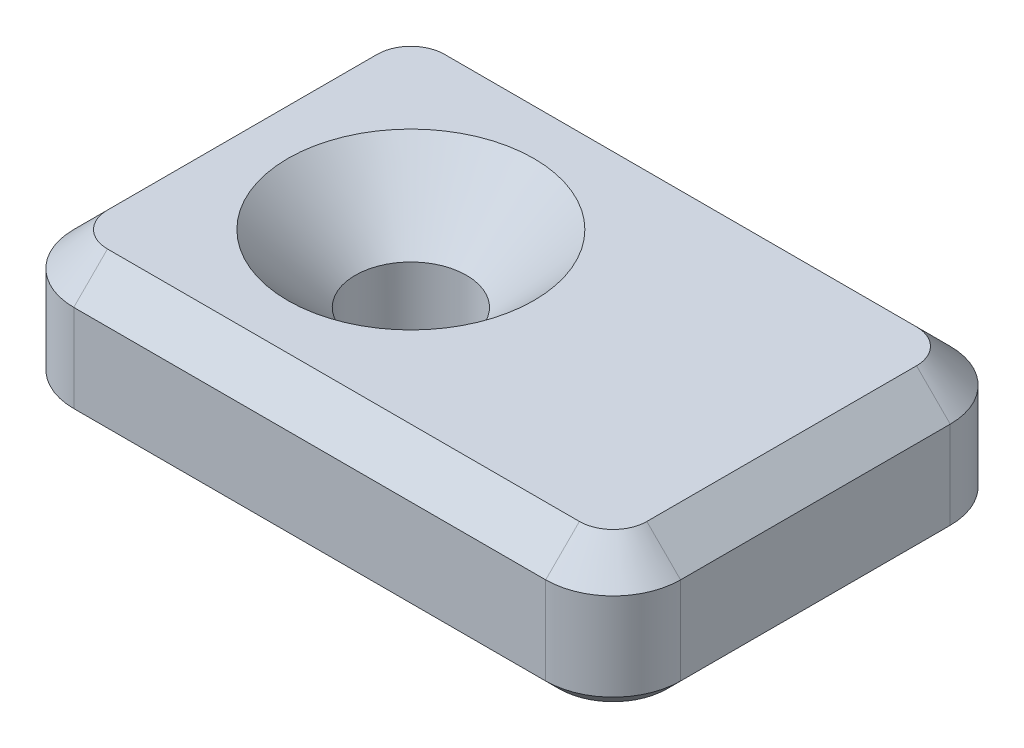
ISO-10303-21;
HEADER;
FILE_DESCRIPTION(('STEP AP214'),'2;1');
FILE_NAME('part.step','',(''),(''),'','','');
FILE_SCHEMA(('AUTOMOTIVE_DESIGN { 1 0 10303 214 1 1 1 1 }'));
ENDSEC;
DATA;
#1=APPLICATION_CONTEXT('core data for automotive mechanical design processes');
#2=APPLICATION_PROTOCOL_DEFINITION('international standard','automotive_design',2000,#1);
#3=PRODUCT_CONTEXT('',#1,'mechanical');
#4=PRODUCT('Part','Part','',(#3));
#5=PRODUCT_RELATED_PRODUCT_CATEGORY('part','',(#4));
#6=PRODUCT_DEFINITION_FORMATION('','',#4);
#7=PRODUCT_DEFINITION_CONTEXT('part definition',#1,'design');
#8=PRODUCT_DEFINITION('design','',#6,#7);
#9=PRODUCT_DEFINITION_SHAPE('','',#8);
#10=(LENGTH_UNIT() NAMED_UNIT(*) SI_UNIT(.MILLI.,.METRE.));
#11=(NAMED_UNIT(*) PLANE_ANGLE_UNIT() SI_UNIT($,.RADIAN.));
#12=(NAMED_UNIT(*) SI_UNIT($,.STERADIAN.) SOLID_ANGLE_UNIT());
#13=UNCERTAINTY_MEASURE_WITH_UNIT(LENGTH_MEASURE(1.E-05),#10,'distance_accuracy_value','');
#14=(GEOMETRIC_REPRESENTATION_CONTEXT(3) GLOBAL_UNCERTAINTY_ASSIGNED_CONTEXT((#13)) GLOBAL_UNIT_ASSIGNED_CONTEXT((#10,
#11,#12)) REPRESENTATION_CONTEXT('',''));
#15=CARTESIAN_POINT('',(0.,0.,0.));
#16=DIRECTION('',(0.,0.,1.));
#17=DIRECTION('',(1.,0.,0.));
#18=AXIS2_PLACEMENT_3D('',#15,#16,#17);
#19=CARTESIAN_POINT('',(16.,4.,-10.));
#20=DIRECTION('',(0.,-1.,0.));
#21=DIRECTION('',(0.,0.,-1.));
#22=AXIS2_PLACEMENT_3D('',#19,#20,#21);
#23=PLANE('',#22);
#24=CARTESIAN_POINT('',(16.,4.,-2.));
#25=DIRECTION('',(0.,-1.,0.));
#26=DIRECTION('',(0.,0.,-1.));
#27=AXIS2_PLACEMENT_3D('',#24,#25,#26);
#28=CIRCLE('',#27,1.);
#29=CARTESIAN_POINT('',(16.,4.,-0.999999999999997));
#30=VERTEX_POINT('',#29);
#31=CARTESIAN_POINT('',(17.,4.,-2.00000000000001));
#32=VERTEX_POINT('',#31);
#33=EDGE_CURVE('E317',#30,#32,#28,.F.);
#34=ORIENTED_EDGE('',*,*,#33,.T.);
#35=DIRECTION('',(0.,0.,-1.));
#36=VECTOR('',#35,1.);
#37=CARTESIAN_POINT('',(17.,4.,-10.));
#38=LINE('',#37,#36);
#39=CARTESIAN_POINT('',(17.,4.,-9.99999999999999));
#40=VERTEX_POINT('',#39);
#41=EDGE_CURVE('E321',#32,#40,#38,.T.);
#42=ORIENTED_EDGE('',*,*,#41,.T.);
#43=CARTESIAN_POINT('',(16.,4.,-10.));
#44=DIRECTION('',(0.,-1.,0.));
#45=DIRECTION('',(0.,0.,-1.));
#46=AXIS2_PLACEMENT_3D('',#43,#44,#45);
#47=CIRCLE('',#46,1.);
#48=CARTESIAN_POINT('',(16.,4.,-11.));
#49=VERTEX_POINT('',#48);
#50=EDGE_CURVE('E319',#40,#49,#47,.F.);
#51=ORIENTED_EDGE('',*,*,#50,.T.);
#52=DIRECTION('',(-1.,0.,0.));
#53=VECTOR('',#52,1.);
#54=CARTESIAN_POINT('',(16.,4.,-11.));
#55=LINE('',#54,#53);
#56=CARTESIAN_POINT('',(2.00000000000001,4.,-11.));
#57=VERTEX_POINT('',#56);
#58=EDGE_CURVE('E165',#49,#57,#55,.T.);
#59=ORIENTED_EDGE('',*,*,#58,.T.);
#60=CARTESIAN_POINT('',(2.,4.,-10.));
#61=DIRECTION('',(0.,-1.,0.));
#62=DIRECTION('',(0.,0.,-1.));
#63=AXIS2_PLACEMENT_3D('',#60,#61,#62);
#64=CIRCLE('',#63,1.);
#65=CARTESIAN_POINT('',(0.999999999999997,4.,-9.99999999999999));
#66=VERTEX_POINT('',#65);
#67=EDGE_CURVE('E159',#57,#66,#64,.F.);
#68=ORIENTED_EDGE('',*,*,#67,.T.);
#69=DIRECTION('',(0.,0.,1.));
#70=VECTOR('',#69,1.);
#71=CARTESIAN_POINT('',(0.999999999999997,4.,-10.));
#72=LINE('',#71,#70);
#73=CARTESIAN_POINT('',(0.999999999999997,4.,-2.00000000000001));
#74=VERTEX_POINT('',#73);
#75=EDGE_CURVE('E162',#66,#74,#72,.T.);
#76=ORIENTED_EDGE('',*,*,#75,.T.);
#77=CARTESIAN_POINT('',(2.,4.,-2.));
#78=DIRECTION('',(0.,-1.,0.));
#79=DIRECTION('',(0.,0.,-1.));
#80=AXIS2_PLACEMENT_3D('',#77,#78,#79);
#81=CIRCLE('',#80,1.);
#82=CARTESIAN_POINT('',(2.00000000000001,4.,-0.999999999999997));
#83=VERTEX_POINT('',#82);
#84=EDGE_CURVE('E171',#74,#83,#81,.F.);
#85=ORIENTED_EDGE('',*,*,#84,.T.);
#86=DIRECTION('',(1.,0.,0.));
#87=VECTOR('',#86,1.);
#88=CARTESIAN_POINT('',(16.,4.,-0.999999999999997));
#89=LINE('',#88,#87);
#90=EDGE_CURVE('E170',#83,#30,#89,.T.);
#91=ORIENTED_EDGE('',*,*,#90,.T.);
#92=EDGE_LOOP('',(#34,#42,#51,#59,#68,#76,#85,#91));
#93=FACE_BOUND('',#92,.T.);
#94=CARTESIAN_POINT('',(6.,4.,-6.));
#95=DIRECTION('',(0.,-1.,0.));
#96=DIRECTION('',(0.,0.,-1.));
#97=AXIS2_PLACEMENT_3D('',#94,#95,#96);
#98=CIRCLE('',#97,3.65000000000001);
#99=CARTESIAN_POINT('',(6.,4.,-9.65000000000001));
#100=VERTEX_POINT('',#99);
#101=EDGE_CURVE('E182',#100,#100,#98,.T.);
#102=ORIENTED_EDGE('',*,*,#101,.T.);
#103=EDGE_LOOP('',(#102));
#104=FACE_BOUND('',#103,.T.);
#105=ADVANCED_FACE('F43',(#93,#104),#23,.F.);
#106=CARTESIAN_POINT('',(16.,0.,-10.));
#107=DIRECTION('',(0.,-1.,0.));
#108=DIRECTION('',(0.,0.,-1.));
#109=AXIS2_PLACEMENT_3D('',#106,#107,#108);
#110=PLANE('',#109);
#111=CARTESIAN_POINT('',(2.,0.,-10.));
#112=DIRECTION('',(0.,-1.,0.));
#113=DIRECTION('',(0.,0.,-1.));
#114=AXIS2_PLACEMENT_3D('',#111,#112,#113);
#115=CIRCLE('',#114,1.6);
#116=CARTESIAN_POINT('',(0.400000000000001,0.,-9.99999999999999));
#117=VERTEX_POINT('',#116);
#118=CARTESIAN_POINT('',(2.00000000000001,0.,-11.6));
#119=VERTEX_POINT('',#118);
#120=EDGE_CURVE('E211',#117,#119,#115,.T.);
#121=ORIENTED_EDGE('',*,*,#120,.T.);
#122=DIRECTION('',(1.,0.,0.));
#123=VECTOR('',#122,1.);
#124=CARTESIAN_POINT('',(16.,0.,-11.6));
#125=LINE('',#124,#123);
#126=CARTESIAN_POINT('',(16.,0.,-11.6));
#127=VERTEX_POINT('',#126);
#128=EDGE_CURVE('E213',#119,#127,#125,.T.);
#129=ORIENTED_EDGE('',*,*,#128,.T.);
#130=CARTESIAN_POINT('',(16.,0.,-10.));
#131=DIRECTION('',(0.,-1.,0.));
#132=DIRECTION('',(0.,0.,-1.));
#133=AXIS2_PLACEMENT_3D('',#130,#131,#132);
#134=CIRCLE('',#133,1.6);
#135=CARTESIAN_POINT('',(17.6,0.,-9.99999999999999));
#136=VERTEX_POINT('',#135);
#137=EDGE_CURVE('E209',#127,#136,#134,.T.);
#138=ORIENTED_EDGE('',*,*,#137,.T.);
#139=DIRECTION('',(0.,0.,1.));
#140=VECTOR('',#139,1.);
#141=CARTESIAN_POINT('',(17.6,0.,-2.00000000000001));
#142=LINE('',#141,#140);
#143=CARTESIAN_POINT('',(17.6,0.,-2.00000000000001));
#144=VERTEX_POINT('',#143);
#145=EDGE_CURVE('E205',#136,#144,#142,.T.);
#146=ORIENTED_EDGE('',*,*,#145,.T.);
#147=CARTESIAN_POINT('',(16.,0.,-2.));
#148=DIRECTION('',(0.,-1.,0.));
#149=DIRECTION('',(0.,0.,-1.));
#150=AXIS2_PLACEMENT_3D('',#147,#148,#149);
#151=CIRCLE('',#150,1.6);
#152=CARTESIAN_POINT('',(16.,0.,-0.400000000000001));
#153=VERTEX_POINT('',#152);
#154=EDGE_CURVE('E201',#144,#153,#151,.T.);
#155=ORIENTED_EDGE('',*,*,#154,.T.);
#156=DIRECTION('',(-1.,0.,0.));
#157=VECTOR('',#156,1.);
#158=CARTESIAN_POINT('',(2.00000000000001,0.,-0.400000000000001));
#159=LINE('',#158,#157);
#160=CARTESIAN_POINT('',(2.00000000000001,0.,-0.400000000000001));
#161=VERTEX_POINT('',#160);
#162=EDGE_CURVE('E198',#153,#161,#159,.T.);
#163=ORIENTED_EDGE('',*,*,#162,.T.);
#164=CARTESIAN_POINT('',(2.,0.,-2.));
#165=DIRECTION('',(0.,-1.,0.));
#166=DIRECTION('',(0.,0.,-1.));
#167=AXIS2_PLACEMENT_3D('',#164,#165,#166);
#168=CIRCLE('',#167,1.6);
#169=CARTESIAN_POINT('',(0.400000000000001,0.,-2.00000000000001));
#170=VERTEX_POINT('',#169);
#171=EDGE_CURVE('E203',#161,#170,#168,.T.);
#172=ORIENTED_EDGE('',*,*,#171,.T.);
#173=DIRECTION('',(0.,0.,-1.));
#174=VECTOR('',#173,1.);
#175=CARTESIAN_POINT('',(0.400000000000001,0.,-9.99999999999999));
#176=LINE('',#175,#174);
#177=EDGE_CURVE('E207',#170,#117,#176,.T.);
#178=ORIENTED_EDGE('',*,*,#177,.T.);
#179=EDGE_LOOP('',(#121,#129,#138,#146,#155,#163,#172,#178));
#180=FACE_BOUND('',#179,.T.);
#181=CARTESIAN_POINT('',(6.,0.,-6.));
#182=DIRECTION('',(0.,1.,0.));
#183=DIRECTION('',(0.,0.,1.));
#184=AXIS2_PLACEMENT_3D('',#181,#182,#183);
#185=CIRCLE('',#184,1.65);
#186=CARTESIAN_POINT('',(6.,0.,-4.35));
#187=VERTEX_POINT('',#186);
#188=EDGE_CURVE('E188',#187,#187,#185,.T.);
#189=ORIENTED_EDGE('',*,*,#188,.T.);
#190=EDGE_LOOP('',(#189));
#191=FACE_BOUND('',#190,.T.);
#192=ADVANCED_FACE('F371',(#180,#191),#110,.T.);
#193=CARTESIAN_POINT('',(16.,4.,-10.));
#194=DIRECTION('',(0.,-1.,0.));
#195=DIRECTION('',(0.,0.,-1.));
#196=AXIS2_PLACEMENT_3D('',#193,#194,#195);
#197=CYLINDRICAL_SURFACE('',#196,2.);
#198=DIRECTION('',(0.,-1.,0.));
#199=VECTOR('',#198,1.);
#200=CARTESIAN_POINT('',(18.,4.,-9.99999999999999));
#201=LINE('',#200,#199);
#202=CARTESIAN_POINT('',(18.,3.,-9.99999999999999));
#203=VERTEX_POINT('',#202);
#204=CARTESIAN_POINT('',(18.,0.399999999999999,-9.99999999999999));
#205=VERTEX_POINT('',#204);
#206=EDGE_CURVE('E330',#203,#205,#201,.T.);
#207=ORIENTED_EDGE('',*,*,#206,.T.);
#208=CARTESIAN_POINT('',(16.,0.399999999999999,-10.));
#209=DIRECTION('',(0.,-1.,0.));
#210=DIRECTION('',(0.,0.,-1.));
#211=AXIS2_PLACEMENT_3D('',#208,#209,#210);
#212=CIRCLE('',#211,2.);
#213=CARTESIAN_POINT('',(16.,0.399999999999999,-12.));
#214=VERTEX_POINT('',#213);
#215=EDGE_CURVE('E218',#205,#214,#212,.F.);
#216=ORIENTED_EDGE('',*,*,#215,.T.);
#217=DIRECTION('',(0.,-1.,0.));
#218=VECTOR('',#217,1.);
#219=CARTESIAN_POINT('',(16.,4.,-12.));
#220=LINE('',#219,#218);
#221=CARTESIAN_POINT('',(16.,3.,-12.));
#222=VERTEX_POINT('',#221);
#223=EDGE_CURVE('E302',#222,#214,#220,.T.);
#224=ORIENTED_EDGE('',*,*,#223,.F.);
#225=CARTESIAN_POINT('',(16.,3.,-10.));
#226=DIRECTION('',(0.,-1.,0.));
#227=DIRECTION('',(0.,0.,-1.));
#228=AXIS2_PLACEMENT_3D('',#225,#226,#227);
#229=CIRCLE('',#228,2.);
#230=EDGE_CURVE('E282',#222,#203,#229,.T.);
#231=ORIENTED_EDGE('',*,*,#230,.T.);
#232=EDGE_LOOP('',(#207,#216,#224,#231));
#233=FACE_BOUND('',#232,.T.);
#234=ADVANCED_FACE('F329',(#233),#197,.T.);
#235=CARTESIAN_POINT('',(2.00000000000001,4.,-12.));
#236=DIRECTION('',(0.,0.,1.));
#237=DIRECTION('',(1.,0.,0.));
#238=AXIS2_PLACEMENT_3D('',#235,#236,#237);
#239=PLANE('',#238);
#240=ORIENTED_EDGE('',*,*,#223,.T.);
#241=DIRECTION('',(-1.,0.,0.));
#242=VECTOR('',#241,1.);
#243=CARTESIAN_POINT('',(2.00000000000001,0.399999999999999,-12.));
#244=LINE('',#243,#242);
#245=CARTESIAN_POINT('',(2.00000000000001,0.399999999999999,-12.));
#246=VERTEX_POINT('',#245);
#247=EDGE_CURVE('E195',#214,#246,#244,.T.);
#248=ORIENTED_EDGE('',*,*,#247,.T.);
#249=DIRECTION('',(0.,-1.,0.));
#250=VECTOR('',#249,1.);
#251=CARTESIAN_POINT('',(2.00000000000001,4.,-12.));
#252=LINE('',#251,#250);
#253=CARTESIAN_POINT('',(2.00000000000001,3.,-12.));
#254=VERTEX_POINT('',#253);
#255=EDGE_CURVE('E300',#254,#246,#252,.T.);
#256=ORIENTED_EDGE('',*,*,#255,.F.);
#257=DIRECTION('',(1.,0.,0.));
#258=VECTOR('',#257,1.);
#259=CARTESIAN_POINT('',(2.00000000000001,3.,-12.));
#260=LINE('',#259,#258);
#261=EDGE_CURVE('E272',#254,#222,#260,.T.);
#262=ORIENTED_EDGE('',*,*,#261,.T.);
#263=EDGE_LOOP('',(#240,#248,#256,#262));
#264=FACE_BOUND('',#263,.T.);
#265=ADVANCED_FACE('F395',(#264),#239,.F.);
#266=CARTESIAN_POINT('',(2.,4.,-10.));
#267=DIRECTION('',(0.,-1.,0.));
#268=DIRECTION('',(0.,0.,-1.));
#269=AXIS2_PLACEMENT_3D('',#266,#267,#268);
#270=CYLINDRICAL_SURFACE('',#269,2.);
#271=ORIENTED_EDGE('',*,*,#255,.T.);
#272=CARTESIAN_POINT('',(2.,0.399999999999999,-10.));
#273=DIRECTION('',(0.,-1.,0.));
#274=DIRECTION('',(0.,0.,-1.));
#275=AXIS2_PLACEMENT_3D('',#272,#273,#274);
#276=CIRCLE('',#275,2.);
#277=CARTESIAN_POINT('',(0.,0.399999999999999,-9.99999999999999));
#278=VERTEX_POINT('',#277);
#279=EDGE_CURVE('E216',#246,#278,#276,.F.);
#280=ORIENTED_EDGE('',*,*,#279,.T.);
#281=DIRECTION('',(0.,-1.,0.));
#282=VECTOR('',#281,1.);
#283=CARTESIAN_POINT('',(0.,4.,-9.99999999999999));
#284=LINE('',#283,#282);
#285=CARTESIAN_POINT('',(0.,3.,-9.99999999999999));
#286=VERTEX_POINT('',#285);
#287=EDGE_CURVE('E293',#286,#278,#284,.T.);
#288=ORIENTED_EDGE('',*,*,#287,.F.);
#289=CARTESIAN_POINT('',(2.,3.,-10.));
#290=DIRECTION('',(0.,-1.,0.));
#291=DIRECTION('',(0.,0.,-1.));
#292=AXIS2_PLACEMENT_3D('',#289,#290,#291);
#293=CIRCLE('',#292,2.);
#294=EDGE_CURVE('E185',#286,#254,#293,.T.);
#295=ORIENTED_EDGE('',*,*,#294,.T.);
#296=EDGE_LOOP('',(#271,#280,#288,#295));
#297=FACE_BOUND('',#296,.T.);
#298=ADVANCED_FACE('F298',(#297),#270,.T.);
#299=CARTESIAN_POINT('',(0.,4.,-2.00000000000001));
#300=DIRECTION('',(1.,0.,0.));
#301=DIRECTION('',(0.,0.,-1.));
#302=AXIS2_PLACEMENT_3D('',#299,#300,#301);
#303=PLANE('',#302);
#304=ORIENTED_EDGE('',*,*,#287,.T.);
#305=DIRECTION('',(0.,0.,1.));
#306=VECTOR('',#305,1.);
#307=CARTESIAN_POINT('',(0.,0.399999999999999,-2.00000000000001));
#308=LINE('',#307,#306);
#309=CARTESIAN_POINT('',(0.,0.399999999999999,-2.00000000000001));
#310=VERTEX_POINT('',#309);
#311=EDGE_CURVE('E220',#278,#310,#308,.T.);
#312=ORIENTED_EDGE('',*,*,#311,.T.);
#313=DIRECTION('',(0.,-1.,0.));
#314=VECTOR('',#313,1.);
#315=CARTESIAN_POINT('',(0.,4.,-2.00000000000001));
#316=LINE('',#315,#314);
#317=CARTESIAN_POINT('',(0.,3.,-2.00000000000001));
#318=VERTEX_POINT('',#317);
#319=EDGE_CURVE('E295',#318,#310,#316,.T.);
#320=ORIENTED_EDGE('',*,*,#319,.F.);
#321=DIRECTION('',(0.,0.,-1.));
#322=VECTOR('',#321,1.);
#323=CARTESIAN_POINT('',(0.,3.,-2.00000000000001));
#324=LINE('',#323,#322);
#325=EDGE_CURVE('E199',#318,#286,#324,.T.);
#326=ORIENTED_EDGE('',*,*,#325,.T.);
#327=EDGE_LOOP('',(#304,#312,#320,#326));
#328=FACE_BOUND('',#327,.T.);
#329=ADVANCED_FACE('F292',(#328),#303,.F.);
#330=CARTESIAN_POINT('',(2.,4.,-2.));
#331=DIRECTION('',(0.,-1.,0.));
#332=DIRECTION('',(0.,0.,-1.));
#333=AXIS2_PLACEMENT_3D('',#330,#331,#332);
#334=CYLINDRICAL_SURFACE('',#333,2.);
#335=ORIENTED_EDGE('',*,*,#319,.T.);
#336=CARTESIAN_POINT('',(2.,0.399999999999999,-2.));
#337=DIRECTION('',(0.,-1.,0.));
#338=DIRECTION('',(0.,0.,-1.));
#339=AXIS2_PLACEMENT_3D('',#336,#337,#338);
#340=CIRCLE('',#339,2.);
#341=CARTESIAN_POINT('',(2.00000000000001,0.399999999999999,0.));
#342=VERTEX_POINT('',#341);
#343=EDGE_CURVE('E67',#310,#342,#340,.F.);
#344=ORIENTED_EDGE('',*,*,#343,.T.);
#345=DIRECTION('',(0.,-1.,0.));
#346=VECTOR('',#345,1.);
#347=CARTESIAN_POINT('',(2.00000000000001,4.,0.));
#348=LINE('',#347,#346);
#349=CARTESIAN_POINT('',(2.00000000000001,3.,0.));
#350=VERTEX_POINT('',#349);
#351=EDGE_CURVE('E304',#350,#342,#348,.T.);
#352=ORIENTED_EDGE('',*,*,#351,.F.);
#353=CARTESIAN_POINT('',(2.,3.,-2.));
#354=DIRECTION('',(0.,-1.,0.));
#355=DIRECTION('',(0.,0.,-1.));
#356=AXIS2_PLACEMENT_3D('',#353,#354,#355);
#357=CIRCLE('',#356,2.);
#358=EDGE_CURVE('E286',#350,#318,#357,.T.);
#359=ORIENTED_EDGE('',*,*,#358,.T.);
#360=EDGE_LOOP('',(#335,#344,#352,#359));
#361=FACE_BOUND('',#360,.T.);
#362=ADVANCED_FACE('F388',(#361),#334,.T.);
#363=CARTESIAN_POINT('',(2.00000000000001,4.,0.));
#364=DIRECTION('',(0.,0.,-1.));
#365=DIRECTION('',(-1.,0.,0.));
#366=AXIS2_PLACEMENT_3D('',#363,#364,#365);
#367=PLANE('',#366);
#368=ORIENTED_EDGE('',*,*,#351,.T.);
#369=DIRECTION('',(1.,0.,0.));
#370=VECTOR('',#369,1.);
#371=CARTESIAN_POINT('',(16.,0.399999999999999,0.));
#372=LINE('',#371,#370);
#373=CARTESIAN_POINT('',(16.,0.399999999999999,0.));
#374=VERTEX_POINT('',#373);
#375=EDGE_CURVE('E11',#342,#374,#372,.T.);
#376=ORIENTED_EDGE('',*,*,#375,.T.);
#377=DIRECTION('',(0.,-1.,0.));
#378=VECTOR('',#377,1.);
#379=CARTESIAN_POINT('',(16.,4.,0.));
#380=LINE('',#379,#378);
#381=CARTESIAN_POINT('',(16.,3.,0.));
#382=VERTEX_POINT('',#381);
#383=EDGE_CURVE('E351',#382,#374,#380,.T.);
#384=ORIENTED_EDGE('',*,*,#383,.F.);
#385=DIRECTION('',(-1.,0.,0.));
#386=VECTOR('',#385,1.);
#387=CARTESIAN_POINT('',(2.00000000000001,3.,0.));
#388=LINE('',#387,#386);
#389=EDGE_CURVE('E278',#382,#350,#388,.T.);
#390=ORIENTED_EDGE('',*,*,#389,.T.);
#391=EDGE_LOOP('',(#368,#376,#384,#390));
#392=FACE_BOUND('',#391,.T.);
#393=ADVANCED_FACE('F353',(#392),#367,.F.);
#394=CARTESIAN_POINT('',(16.,4.,-2.));
#395=DIRECTION('',(0.,-1.,0.));
#396=DIRECTION('',(0.,0.,-1.));
#397=AXIS2_PLACEMENT_3D('',#394,#395,#396);
#398=CYLINDRICAL_SURFACE('',#397,2.);
#399=ORIENTED_EDGE('',*,*,#383,.T.);
#400=CARTESIAN_POINT('',(16.,0.399999999999999,-2.));
#401=DIRECTION('',(0.,-1.,0.));
#402=DIRECTION('',(0.,0.,-1.));
#403=AXIS2_PLACEMENT_3D('',#400,#401,#402);
#404=CIRCLE('',#403,2.);
#405=CARTESIAN_POINT('',(18.,0.399999999999999,-2.00000000000001));
#406=VERTEX_POINT('',#405);
#407=EDGE_CURVE('E53',#374,#406,#404,.F.);
#408=ORIENTED_EDGE('',*,*,#407,.T.);
#409=DIRECTION('',(0.,-1.,0.));
#410=VECTOR('',#409,1.);
#411=CARTESIAN_POINT('',(18.,4.,-2.00000000000001));
#412=LINE('',#411,#410);
#413=CARTESIAN_POINT('',(18.,3.,-2.00000000000001));
#414=VERTEX_POINT('',#413);
#415=EDGE_CURVE('E338',#414,#406,#412,.T.);
#416=ORIENTED_EDGE('',*,*,#415,.F.);
#417=CARTESIAN_POINT('',(16.,3.,-2.));
#418=DIRECTION('',(0.,-1.,0.));
#419=DIRECTION('',(0.,0.,-1.));
#420=AXIS2_PLACEMENT_3D('',#417,#418,#419);
#421=CIRCLE('',#420,2.);
#422=EDGE_CURVE('E279',#414,#382,#421,.T.);
#423=ORIENTED_EDGE('',*,*,#422,.T.);
#424=EDGE_LOOP('',(#399,#408,#416,#423));
#425=FACE_BOUND('',#424,.T.);
#426=ADVANCED_FACE('F350',(#425),#398,.T.);
#427=CARTESIAN_POINT('',(18.,4.,-2.00000000000001));
#428=DIRECTION('',(-1.,0.,0.));
#429=DIRECTION('',(0.,0.,1.));
#430=AXIS2_PLACEMENT_3D('',#427,#428,#429);
#431=PLANE('',#430);
#432=ORIENTED_EDGE('',*,*,#415,.T.);
#433=DIRECTION('',(0.,0.,-1.));
#434=VECTOR('',#433,1.);
#435=CARTESIAN_POINT('',(18.,0.399999999999999,-9.99999999999999));
#436=LINE('',#435,#434);
#437=EDGE_CURVE('E222',#406,#205,#436,.T.);
#438=ORIENTED_EDGE('',*,*,#437,.T.);
#439=ORIENTED_EDGE('',*,*,#206,.F.);
#440=DIRECTION('',(0.,0.,1.));
#441=VECTOR('',#440,1.);
#442=CARTESIAN_POINT('',(18.,3.,-2.00000000000001));
#443=LINE('',#442,#441);
#444=EDGE_CURVE('E324',#203,#414,#443,.T.);
#445=ORIENTED_EDGE('',*,*,#444,.T.);
#446=EDGE_LOOP('',(#432,#438,#439,#445));
#447=FACE_BOUND('',#446,.T.);
#448=ADVANCED_FACE('F335',(#447),#431,.F.);
#449=CARTESIAN_POINT('',(6.,4.,-6.));
#450=DIRECTION('',(0.,-1.,0.));
#451=DIRECTION('',(0.,0.,-1.));
#452=AXIS2_PLACEMENT_3D('',#449,#450,#451);
#453=CYLINDRICAL_SURFACE('',#452,1.65);
#454=CARTESIAN_POINT('',(6.,2.,-6.));
#455=DIRECTION('',(0.,-1.,0.));
#456=DIRECTION('',(0.,0.,-1.));
#457=AXIS2_PLACEMENT_3D('',#454,#455,#456);
#458=CIRCLE('',#457,1.65);
#459=CARTESIAN_POINT('',(6.,2.,-7.65));
#460=VERTEX_POINT('',#459);
#461=EDGE_CURVE('E309',#460,#460,#458,.F.);
#462=ORIENTED_EDGE('',*,*,#461,.T.);
#463=EDGE_LOOP('',(#462));
#464=FACE_BOUND('',#463,.T.);
#465=ORIENTED_EDGE('',*,*,#188,.F.);
#466=EDGE_LOOP('',(#465));
#467=FACE_BOUND('',#466,.T.);
#468=ADVANCED_FACE('F380',(#464,#467),#453,.F.);
#469=CARTESIAN_POINT('',(6.,2.,-6.));
#470=DIRECTION('',(0.,1.,0.));
#471=DIRECTION('',(0.,0.,1.));
#472=AXIS2_PLACEMENT_3D('',#469,#470,#471);
#473=CONICAL_SURFACE('',#472,1.65,0.78539816339745);
#474=ORIENTED_EDGE('',*,*,#101,.F.);
#475=EDGE_LOOP('',(#474));
#476=FACE_BOUND('',#475,.T.);
#477=ORIENTED_EDGE('',*,*,#461,.F.);
#478=EDGE_LOOP('',(#477));
#479=FACE_BOUND('',#478,.T.);
#480=ADVANCED_FACE('F367',(#476,#479),#473,.F.);
#481=CARTESIAN_POINT('',(0.999999999999997,4.,-10.));
#482=DIRECTION('',(0.707106781186549,-0.707106781186546,0.));
#483=DIRECTION('',(0.,0.,1.));
#484=AXIS2_PLACEMENT_3D('',#481,#482,#483);
#485=PLANE('',#484);
#486=DIRECTION('',(0.707106781186546,0.707106781186549,0.));
#487=VECTOR('',#486,1.);
#488=CARTESIAN_POINT('',(0.,3.,-9.99999999999999));
#489=LINE('',#488,#487);
#490=EDGE_CURVE('E177',#286,#66,#489,.T.);
#491=ORIENTED_EDGE('',*,*,#490,.F.);
#492=ORIENTED_EDGE('',*,*,#325,.F.);
#493=DIRECTION('',(-0.707106781186546,-0.707106781186549,0.));
#494=VECTOR('',#493,1.);
#495=CARTESIAN_POINT('',(0.999999999999997,4.,-2.00000000000001));
#496=LINE('',#495,#494);
#497=EDGE_CURVE('E180',#74,#318,#496,.T.);
#498=ORIENTED_EDGE('',*,*,#497,.F.);
#499=ORIENTED_EDGE('',*,*,#75,.F.);
#500=EDGE_LOOP('',(#491,#492,#498,#499));
#501=FACE_BOUND('',#500,.T.);
#502=ADVANCED_FACE('F175',(#501),#485,.F.);
#503=CARTESIAN_POINT('',(2.,4.,-2.));
#504=DIRECTION('',(0.,-1.,0.));
#505=DIRECTION('',(0.,0.,-1.));
#506=AXIS2_PLACEMENT_3D('',#503,#504,#505);
#507=CONICAL_SURFACE('',#506,1.,0.785398163397446);
#508=ORIENTED_EDGE('',*,*,#497,.T.);
#509=ORIENTED_EDGE('',*,*,#358,.F.);
#510=DIRECTION('',(0.,-0.707106781186549,0.707106781186546));
#511=VECTOR('',#510,1.);
#512=CARTESIAN_POINT('',(2.00000000000001,4.,-0.999999999999997));
#513=LINE('',#512,#511);
#514=EDGE_CURVE('E186',#83,#350,#513,.T.);
#515=ORIENTED_EDGE('',*,*,#514,.F.);
#516=ORIENTED_EDGE('',*,*,#84,.F.);
#517=EDGE_LOOP('',(#508,#509,#515,#516));
#518=FACE_BOUND('',#517,.T.);
#519=ADVANCED_FACE('F359',(#518),#507,.T.);
#520=CARTESIAN_POINT('',(2.,4.,-10.));
#521=DIRECTION('',(0.,-1.,0.));
#522=DIRECTION('',(0.,0.,-1.));
#523=AXIS2_PLACEMENT_3D('',#520,#521,#522);
#524=CONICAL_SURFACE('',#523,1.,0.785398163397446);
#525=ORIENTED_EDGE('',*,*,#490,.T.);
#526=ORIENTED_EDGE('',*,*,#67,.F.);
#527=DIRECTION('',(0.,0.707106781186549,0.707106781186546));
#528=VECTOR('',#527,1.);
#529=CARTESIAN_POINT('',(2.00000000000001,3.,-12.));
#530=LINE('',#529,#528);
#531=EDGE_CURVE('E191',#254,#57,#530,.T.);
#532=ORIENTED_EDGE('',*,*,#531,.F.);
#533=ORIENTED_EDGE('',*,*,#294,.F.);
#534=EDGE_LOOP('',(#525,#526,#532,#533));
#535=FACE_BOUND('',#534,.T.);
#536=ADVANCED_FACE('F184',(#535),#524,.T.);
#537=CARTESIAN_POINT('',(16.,4.,-0.999999999999997));
#538=DIRECTION('',(0.,-0.707106781186546,-0.707106781186549));
#539=DIRECTION('',(1.,0.,0.));
#540=AXIS2_PLACEMENT_3D('',#537,#538,#539);
#541=PLANE('',#540);
#542=ORIENTED_EDGE('',*,*,#514,.T.);
#543=ORIENTED_EDGE('',*,*,#389,.F.);
#544=DIRECTION('',(0.,-0.707106781186549,0.707106781186546));
#545=VECTOR('',#544,1.);
#546=CARTESIAN_POINT('',(16.,4.,-0.999999999999997));
#547=LINE('',#546,#545);
#548=EDGE_CURVE('E266',#30,#382,#547,.T.);
#549=ORIENTED_EDGE('',*,*,#548,.F.);
#550=ORIENTED_EDGE('',*,*,#90,.F.);
#551=EDGE_LOOP('',(#542,#543,#549,#550));
#552=FACE_BOUND('',#551,.T.);
#553=ADVANCED_FACE('F356',(#552),#541,.F.);
#554=CARTESIAN_POINT('',(16.,4.,-11.));
#555=DIRECTION('',(0.,-0.707106781186546,0.707106781186549));
#556=DIRECTION('',(-1.,0.,0.));
#557=AXIS2_PLACEMENT_3D('',#554,#555,#556);
#558=PLANE('',#557);
#559=ORIENTED_EDGE('',*,*,#531,.T.);
#560=ORIENTED_EDGE('',*,*,#58,.F.);
#561=DIRECTION('',(0.,0.707106781186549,0.707106781186546));
#562=VECTOR('',#561,1.);
#563=CARTESIAN_POINT('',(16.,3.,-12.));
#564=LINE('',#563,#562);
#565=EDGE_CURVE('E259',#222,#49,#564,.T.);
#566=ORIENTED_EDGE('',*,*,#565,.F.);
#567=ORIENTED_EDGE('',*,*,#261,.F.);
#568=EDGE_LOOP('',(#559,#560,#566,#567));
#569=FACE_BOUND('',#568,.T.);
#570=ADVANCED_FACE('F270',(#569),#558,.F.);
#571=CARTESIAN_POINT('',(16.,4.,-2.));
#572=DIRECTION('',(0.,-1.,0.));
#573=DIRECTION('',(0.,0.,-1.));
#574=AXIS2_PLACEMENT_3D('',#571,#572,#573);
#575=CONICAL_SURFACE('',#574,1.,0.785398163397446);
#576=ORIENTED_EDGE('',*,*,#548,.T.);
#577=ORIENTED_EDGE('',*,*,#422,.F.);
#578=DIRECTION('',(0.707106781186546,-0.707106781186549,0.));
#579=VECTOR('',#578,1.);
#580=CARTESIAN_POINT('',(17.,4.,-2.00000000000001));
#581=LINE('',#580,#579);
#582=EDGE_CURVE('E252',#32,#414,#581,.T.);
#583=ORIENTED_EDGE('',*,*,#582,.F.);
#584=ORIENTED_EDGE('',*,*,#33,.F.);
#585=EDGE_LOOP('',(#576,#577,#583,#584));
#586=FACE_BOUND('',#585,.T.);
#587=ADVANCED_FACE('F348',(#586),#575,.T.);
#588=CARTESIAN_POINT('',(16.,4.,-10.));
#589=DIRECTION('',(0.,-1.,0.));
#590=DIRECTION('',(0.,0.,-1.));
#591=AXIS2_PLACEMENT_3D('',#588,#589,#590);
#592=CONICAL_SURFACE('',#591,1.,0.785398163397446);
#593=ORIENTED_EDGE('',*,*,#565,.T.);
#594=ORIENTED_EDGE('',*,*,#50,.F.);
#595=DIRECTION('',(-0.707106781186546,0.707106781186549,0.));
#596=VECTOR('',#595,1.);
#597=CARTESIAN_POINT('',(18.,3.,-9.99999999999999));
#598=LINE('',#597,#596);
#599=EDGE_CURVE('E247',#203,#40,#598,.T.);
#600=ORIENTED_EDGE('',*,*,#599,.F.);
#601=ORIENTED_EDGE('',*,*,#230,.F.);
#602=EDGE_LOOP('',(#593,#594,#600,#601));
#603=FACE_BOUND('',#602,.T.);
#604=ADVANCED_FACE('F343',(#603),#592,.T.);
#605=CARTESIAN_POINT('',(17.,4.,-10.));
#606=DIRECTION('',(-0.707106781186549,-0.707106781186546,0.));
#607=DIRECTION('',(0.,0.,-1.));
#608=AXIS2_PLACEMENT_3D('',#605,#606,#607);
#609=PLANE('',#608);
#610=ORIENTED_EDGE('',*,*,#582,.T.);
#611=ORIENTED_EDGE('',*,*,#444,.F.);
#612=ORIENTED_EDGE('',*,*,#599,.T.);
#613=ORIENTED_EDGE('',*,*,#41,.F.);
#614=EDGE_LOOP('',(#610,#611,#612,#613));
#615=FACE_BOUND('',#614,.T.);
#616=ADVANCED_FACE('F340',(#615),#609,.F.);
#617=CARTESIAN_POINT('',(2.00000000000001,0.399999999999999,0.));
#618=DIRECTION('',(0.,-0.707106781186549,0.707106781186546));
#619=DIRECTION('',(-1.,0.,0.));
#620=AXIS2_PLACEMENT_3D('',#617,#618,#619);
#621=PLANE('',#620);
#622=DIRECTION('',(0.,0.707106781186546,0.707106781186549));
#623=VECTOR('',#622,1.);
#624=CARTESIAN_POINT('',(2.00000000000001,0.,-0.400000000000001));
#625=LINE('',#624,#623);
#626=EDGE_CURVE('E241',#161,#342,#625,.T.);
#627=ORIENTED_EDGE('',*,*,#626,.F.);
#628=ORIENTED_EDGE('',*,*,#162,.F.);
#629=DIRECTION('',(0.,-0.707106781186546,-0.707106781186549));
#630=VECTOR('',#629,1.);
#631=CARTESIAN_POINT('',(16.,0.399999999999999,0.));
#632=LINE('',#631,#630);
#633=EDGE_CURVE('E48',#374,#153,#632,.T.);
#634=ORIENTED_EDGE('',*,*,#633,.F.);
#635=ORIENTED_EDGE('',*,*,#375,.F.);
#636=EDGE_LOOP('',(#627,#628,#634,#635));
#637=FACE_BOUND('',#636,.T.);
#638=ADVANCED_FACE('F46',(#637),#621,.T.);
#639=CARTESIAN_POINT('',(16.,0.399999999999999,-2.));
#640=DIRECTION('',(0.,1.,0.));
#641=DIRECTION('',(0.,0.,1.));
#642=AXIS2_PLACEMENT_3D('',#639,#640,#641);
#643=CONICAL_SURFACE('',#642,2.,0.785398163397451);
#644=ORIENTED_EDGE('',*,*,#633,.T.);
#645=ORIENTED_EDGE('',*,*,#154,.F.);
#646=DIRECTION('',(-0.707106781186549,-0.707106781186546,0.));
#647=VECTOR('',#646,1.);
#648=CARTESIAN_POINT('',(18.,0.399999999999999,-2.00000000000001));
#649=LINE('',#648,#647);
#650=EDGE_CURVE('E239',#406,#144,#649,.T.);
#651=ORIENTED_EDGE('',*,*,#650,.F.);
#652=ORIENTED_EDGE('',*,*,#407,.F.);
#653=EDGE_LOOP('',(#644,#645,#651,#652));
#654=FACE_BOUND('',#653,.T.);
#655=ADVANCED_FACE('F479',(#654),#643,.T.);
#656=CARTESIAN_POINT('',(2.,0.399999999999999,-2.));
#657=DIRECTION('',(0.,1.,0.));
#658=DIRECTION('',(0.,0.,1.));
#659=AXIS2_PLACEMENT_3D('',#656,#657,#658);
#660=CONICAL_SURFACE('',#659,2.,0.78539816339745);
#661=ORIENTED_EDGE('',*,*,#626,.T.);
#662=ORIENTED_EDGE('',*,*,#343,.F.);
#663=DIRECTION('',(-0.707106781186549,0.707106781186546,0.));
#664=VECTOR('',#663,1.);
#665=CARTESIAN_POINT('',(0.400000000000001,0.,-2.00000000000001));
#666=LINE('',#665,#664);
#667=EDGE_CURVE('E236',#170,#310,#666,.T.);
#668=ORIENTED_EDGE('',*,*,#667,.F.);
#669=ORIENTED_EDGE('',*,*,#171,.F.);
#670=EDGE_LOOP('',(#661,#662,#668,#669));
#671=FACE_BOUND('',#670,.T.);
#672=ADVANCED_FACE('F473',(#671),#660,.T.);
#673=CARTESIAN_POINT('',(18.,0.399999999999999,-2.00000000000001));
#674=DIRECTION('',(0.707106781186546,-0.707106781186549,0.));
#675=DIRECTION('',(0.,0.,1.));
#676=AXIS2_PLACEMENT_3D('',#673,#674,#675);
#677=PLANE('',#676);
#678=ORIENTED_EDGE('',*,*,#650,.T.);
#679=ORIENTED_EDGE('',*,*,#145,.F.);
#680=DIRECTION('',(-0.707106781186549,-0.707106781186546,0.));
#681=VECTOR('',#680,1.);
#682=CARTESIAN_POINT('',(18.,0.399999999999999,-9.99999999999999));
#683=LINE('',#682,#681);
#684=EDGE_CURVE('E233',#205,#136,#683,.T.);
#685=ORIENTED_EDGE('',*,*,#684,.F.);
#686=ORIENTED_EDGE('',*,*,#437,.F.);
#687=EDGE_LOOP('',(#678,#679,#685,#686));
#688=FACE_BOUND('',#687,.T.);
#689=ADVANCED_FACE('F466',(#688),#677,.T.);
#690=CARTESIAN_POINT('',(0.,0.399999999999999,-2.00000000000001));
#691=DIRECTION('',(-0.707106781186546,-0.707106781186549,0.));
#692=DIRECTION('',(0.,0.,-1.));
#693=AXIS2_PLACEMENT_3D('',#690,#691,#692);
#694=PLANE('',#693);
#695=ORIENTED_EDGE('',*,*,#667,.T.);
#696=ORIENTED_EDGE('',*,*,#311,.F.);
#697=DIRECTION('',(-0.707106781186549,0.707106781186546,0.));
#698=VECTOR('',#697,1.);
#699=CARTESIAN_POINT('',(0.400000000000001,0.,-9.99999999999999));
#700=LINE('',#699,#698);
#701=EDGE_CURVE('E230',#117,#278,#700,.T.);
#702=ORIENTED_EDGE('',*,*,#701,.F.);
#703=ORIENTED_EDGE('',*,*,#177,.F.);
#704=EDGE_LOOP('',(#695,#696,#702,#703));
#705=FACE_BOUND('',#704,.T.);
#706=ADVANCED_FACE('F459',(#705),#694,.T.);
#707=CARTESIAN_POINT('',(16.,0.399999999999999,-10.));
#708=DIRECTION('',(0.,1.,0.));
#709=DIRECTION('',(0.,0.,1.));
#710=AXIS2_PLACEMENT_3D('',#707,#708,#709);
#711=CONICAL_SURFACE('',#710,2.,0.785398163397449);
#712=ORIENTED_EDGE('',*,*,#684,.T.);
#713=ORIENTED_EDGE('',*,*,#137,.F.);
#714=DIRECTION('',(0.,-0.707106781186547,0.707106781186547));
#715=VECTOR('',#714,1.);
#716=CARTESIAN_POINT('',(16.,0.399999999999999,-12.));
#717=LINE('',#716,#715);
#718=EDGE_CURVE('E228',#214,#127,#717,.T.);
#719=ORIENTED_EDGE('',*,*,#718,.F.);
#720=ORIENTED_EDGE('',*,*,#215,.F.);
#721=EDGE_LOOP('',(#712,#713,#719,#720));
#722=FACE_BOUND('',#721,.T.);
#723=ADVANCED_FACE('F452',(#722),#711,.T.);
#724=CARTESIAN_POINT('',(2.,0.399999999999999,-10.));
#725=DIRECTION('',(0.,1.,0.));
#726=DIRECTION('',(0.,0.,1.));
#727=AXIS2_PLACEMENT_3D('',#724,#725,#726);
#728=CONICAL_SURFACE('',#727,2.,0.78539816339745);
#729=ORIENTED_EDGE('',*,*,#701,.T.);
#730=ORIENTED_EDGE('',*,*,#279,.F.);
#731=DIRECTION('',(0.,0.707106781186546,-0.707106781186549));
#732=VECTOR('',#731,1.);
#733=CARTESIAN_POINT('',(2.00000000000001,0.,-11.6));
#734=LINE('',#733,#732);
#735=EDGE_CURVE('E226',#119,#246,#734,.T.);
#736=ORIENTED_EDGE('',*,*,#735,.F.);
#737=ORIENTED_EDGE('',*,*,#120,.F.);
#738=EDGE_LOOP('',(#729,#730,#736,#737));
#739=FACE_BOUND('',#738,.T.);
#740=ADVANCED_FACE('F445',(#739),#728,.T.);
#741=CARTESIAN_POINT('',(2.00000000000001,0.399999999999999,-12.));
#742=DIRECTION('',(0.,-0.707106781186549,-0.707106781186546));
#743=DIRECTION('',(1.,0.,0.));
#744=AXIS2_PLACEMENT_3D('',#741,#742,#743);
#745=PLANE('',#744);
#746=ORIENTED_EDGE('',*,*,#718,.T.);
#747=ORIENTED_EDGE('',*,*,#128,.F.);
#748=ORIENTED_EDGE('',*,*,#735,.T.);
#749=ORIENTED_EDGE('',*,*,#247,.F.);
#750=EDGE_LOOP('',(#746,#747,#748,#749));
#751=FACE_BOUND('',#750,.T.);
#752=ADVANCED_FACE('F439',(#751),#745,.T.);
#753=CLOSED_SHELL('',(#105,#192,#234,#265,#298,#329,#362,#393,#426,#448,#468,#480,#502,#519,
#536,#553,#570,#587,#604,#616,#638,#655,#672,#689,#706,#723,#740,#752));
#754=MANIFOLD_SOLID_BREP('B2',#753);
#755=ADVANCED_BREP_SHAPE_REPRESENTATION('',(#18,#754),#14);
#756=SHAPE_DEFINITION_REPRESENTATION(#9,#755);
ENDSEC;
END-ISO-10303-21;
